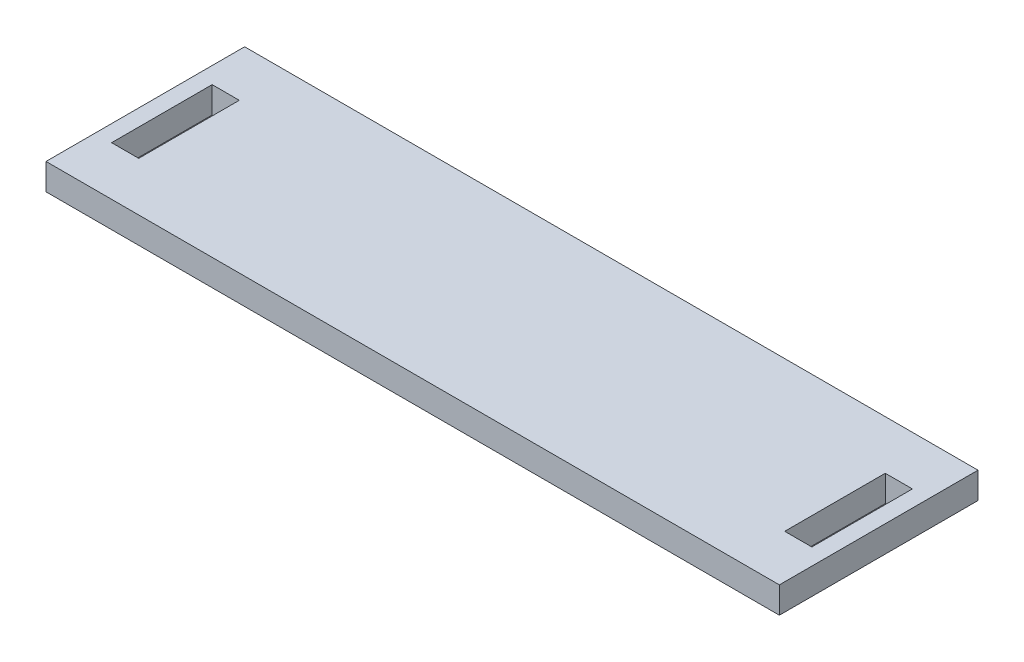
ISO-10303-21;
HEADER;
FILE_DESCRIPTION(('STEP AP214'),'2;1');
FILE_NAME('part.step','',(''),(''),'','','');
FILE_SCHEMA(('AUTOMOTIVE_DESIGN { 1 0 10303 214 1 1 1 1 }'));
ENDSEC;
DATA;
#1=APPLICATION_CONTEXT('core data for automotive mechanical design processes');
#2=APPLICATION_PROTOCOL_DEFINITION('international standard','automotive_design',2000,#1);
#3=PRODUCT_CONTEXT('',#1,'mechanical');
#4=PRODUCT('Part','Part','',(#3));
#5=PRODUCT_RELATED_PRODUCT_CATEGORY('part','',(#4));
#6=PRODUCT_DEFINITION_FORMATION('','',#4);
#7=PRODUCT_DEFINITION_CONTEXT('part definition',#1,'design');
#8=PRODUCT_DEFINITION('design','',#6,#7);
#9=PRODUCT_DEFINITION_SHAPE('','',#8);
#10=(LENGTH_UNIT() NAMED_UNIT(*) SI_UNIT(.MILLI.,.METRE.));
#11=(NAMED_UNIT(*) PLANE_ANGLE_UNIT() SI_UNIT($,.RADIAN.));
#12=(NAMED_UNIT(*) SI_UNIT($,.STERADIAN.) SOLID_ANGLE_UNIT());
#13=UNCERTAINTY_MEASURE_WITH_UNIT(LENGTH_MEASURE(1.E-05),#10,'distance_accuracy_value','');
#14=(GEOMETRIC_REPRESENTATION_CONTEXT(3) GLOBAL_UNCERTAINTY_ASSIGNED_CONTEXT((#13)) GLOBAL_UNIT_ASSIGNED_CONTEXT((#10,
#11,#12)) REPRESENTATION_CONTEXT('',''));
#15=CARTESIAN_POINT('',(0.,0.,0.));
#16=DIRECTION('',(0.,0.,1.));
#17=DIRECTION('',(1.,0.,0.));
#18=AXIS2_PLACEMENT_3D('',#15,#16,#17);
#19=CARTESIAN_POINT('',(0.,3.18,0.));
#20=DIRECTION('',(0.,1.,0.));
#21=DIRECTION('',(0.,0.,1.));
#22=AXIS2_PLACEMENT_3D('',#19,#20,#21);
#23=PLANE('',#22);
#24=DIRECTION('',(0.,0.,1.));
#25=VECTOR('',#24,1.);
#26=CARTESIAN_POINT('',(-55.788376753507,3.18,-0.461132264529056));
#27=LINE('',#26,#25);
#28=CARTESIAN_POINT('',(-55.788376753507,3.18,-0.461132264529056));
#29=VERTEX_POINT('',#28);
#30=CARTESIAN_POINT('',(-55.788376753507,3.18,11.6888677354709));
#31=VERTEX_POINT('',#30);
#32=EDGE_CURVE('E169',#29,#31,#27,.T.);
#33=ORIENTED_EDGE('',*,*,#32,.F.);
#34=DIRECTION('',(-1.,0.,0.));
#35=VECTOR('',#34,1.);
#36=CARTESIAN_POINT('',(-55.788376753507,3.18,-0.461132264529056));
#37=LINE('',#36,#35);
#38=CARTESIAN_POINT('',(-52.508376753507,3.18,-0.461132264529055));
#39=VERTEX_POINT('',#38);
#40=EDGE_CURVE('E174',#39,#29,#37,.T.);
#41=ORIENTED_EDGE('',*,*,#40,.F.);
#42=DIRECTION('',(0.,0.,-1.));
#43=VECTOR('',#42,1.);
#44=CARTESIAN_POINT('',(-52.508376753507,3.18,-0.461132264529055));
#45=LINE('',#44,#43);
#46=CARTESIAN_POINT('',(-52.508376753507,3.18,11.6888677354709));
#47=VERTEX_POINT('',#46);
#48=EDGE_CURVE('E188',#47,#39,#45,.T.);
#49=ORIENTED_EDGE('',*,*,#48,.F.);
#50=DIRECTION('',(1.,0.,0.));
#51=VECTOR('',#50,1.);
#52=CARTESIAN_POINT('',(-55.788376753507,3.18,11.6888677354709));
#53=LINE('',#52,#51);
#54=EDGE_CURVE('E185',#31,#47,#53,.T.);
#55=ORIENTED_EDGE('',*,*,#54,.F.);
#56=EDGE_LOOP('',(#33,#41,#49,#55));
#57=FACE_BOUND('',#56,.T.);
#58=DIRECTION('',(-1.,0.,0.));
#59=VECTOR('',#58,1.);
#60=CARTESIAN_POINT('',(-55.788376753507,3.18,-6.38613226452906));
#61=LINE('',#60,#59);
#62=CARTESIAN_POINT('',(30.821623246493,3.18,-6.38613226452906));
#63=VERTEX_POINT('',#62);
#64=CARTESIAN_POINT('',(-57.788376753507,3.18,-6.38613226452906));
#65=VERTEX_POINT('',#64);
#66=EDGE_CURVE('E11',#63,#65,#61,.T.);
#67=ORIENTED_EDGE('',*,*,#66,.T.);
#68=DIRECTION('',(0.,0.,-1.));
#69=VECTOR('',#68,1.);
#70=CARTESIAN_POINT('',(-57.788376753507,3.18,17.6138677354709));
#71=LINE('',#70,#69);
#72=CARTESIAN_POINT('',(-57.788376753507,3.18,17.6138677354709));
#73=VERTEX_POINT('',#72);
#74=EDGE_CURVE('E210',#73,#65,#71,.T.);
#75=ORIENTED_EDGE('',*,*,#74,.F.);
#76=DIRECTION('',(1.,0.,0.));
#77=VECTOR('',#76,1.);
#78=CARTESIAN_POINT('',(-55.788376753507,3.18,17.6138677354709));
#79=LINE('',#78,#77);
#80=CARTESIAN_POINT('',(30.821623246493,3.18,17.6138677354709));
#81=VERTEX_POINT('',#80);
#82=EDGE_CURVE('E42',#73,#81,#79,.T.);
#83=ORIENTED_EDGE('',*,*,#82,.T.);
#84=DIRECTION('',(0.,0.,-1.));
#85=VECTOR('',#84,1.);
#86=CARTESIAN_POINT('',(30.821623246493,3.18,17.6138677354709));
#87=LINE('',#86,#85);
#88=EDGE_CURVE('E160',#81,#63,#87,.T.);
#89=ORIENTED_EDGE('',*,*,#88,.T.);
#90=EDGE_LOOP('',(#67,#75,#83,#89));
#91=FACE_BOUND('',#90,.T.);
#92=DIRECTION('',(1.,0.,0.));
#93=VECTOR('',#92,1.);
#94=CARTESIAN_POINT('',(28.821623246493,3.18,-0.461132264529062));
#95=LINE('',#94,#93);
#96=CARTESIAN_POINT('',(25.541623246493,3.18,-0.461132264529061));
#97=VERTEX_POINT('',#96);
#98=CARTESIAN_POINT('',(28.821623246493,3.18,-0.461132264529062));
#99=VERTEX_POINT('',#98);
#100=EDGE_CURVE('E148',#97,#99,#95,.T.);
#101=ORIENTED_EDGE('',*,*,#100,.T.);
#102=DIRECTION('',(0.,0.,1.));
#103=VECTOR('',#102,1.);
#104=CARTESIAN_POINT('',(28.821623246493,3.18,-0.461132264529062));
#105=LINE('',#104,#103);
#106=CARTESIAN_POINT('',(28.821623246493,3.18,11.6888677354709));
#107=VERTEX_POINT('',#106);
#108=EDGE_CURVE('E50',#99,#107,#105,.T.);
#109=ORIENTED_EDGE('',*,*,#108,.T.);
#110=DIRECTION('',(-1.,0.,0.));
#111=VECTOR('',#110,1.);
#112=CARTESIAN_POINT('',(28.821623246493,3.18,11.6888677354709));
#113=LINE('',#112,#111);
#114=CARTESIAN_POINT('',(25.541623246493,3.18,11.6888677354709));
#115=VERTEX_POINT('',#114);
#116=EDGE_CURVE('E139',#107,#115,#113,.T.);
#117=ORIENTED_EDGE('',*,*,#116,.T.);
#118=DIRECTION('',(0.,0.,-1.));
#119=VECTOR('',#118,1.);
#120=CARTESIAN_POINT('',(25.541623246493,3.18,-0.461132264529061));
#121=LINE('',#120,#119);
#122=EDGE_CURVE('E142',#115,#97,#121,.T.);
#123=ORIENTED_EDGE('',*,*,#122,.T.);
#124=EDGE_LOOP('',(#101,#109,#117,#123));
#125=FACE_BOUND('',#124,.T.);
#126=ADVANCED_FACE('F33',(#57,#91,#125),#23,.T.);
#127=CARTESIAN_POINT('',(0.,0.,0.));
#128=DIRECTION('',(0.,1.,0.));
#129=DIRECTION('',(0.,0.,1.));
#130=AXIS2_PLACEMENT_3D('',#127,#128,#129);
#131=PLANE('',#130);
#132=DIRECTION('',(1.,0.,0.));
#133=VECTOR('',#132,1.);
#134=CARTESIAN_POINT('',(-55.788376753507,0.,17.6138677354709));
#135=LINE('',#134,#133);
#136=CARTESIAN_POINT('',(-57.788376753507,0.,17.6138677354709));
#137=VERTEX_POINT('',#136);
#138=CARTESIAN_POINT('',(30.821623246493,0.,17.6138677354709));
#139=VERTEX_POINT('',#138);
#140=EDGE_CURVE('E213',#137,#139,#135,.T.);
#141=ORIENTED_EDGE('',*,*,#140,.F.);
#142=DIRECTION('',(0.,0.,1.));
#143=VECTOR('',#142,1.);
#144=CARTESIAN_POINT('',(-57.788376753507,0.,-6.38613226452906));
#145=LINE('',#144,#143);
#146=CARTESIAN_POINT('',(-57.788376753507,0.,-6.38613226452906));
#147=VERTEX_POINT('',#146);
#148=EDGE_CURVE('E204',#147,#137,#145,.T.);
#149=ORIENTED_EDGE('',*,*,#148,.F.);
#150=DIRECTION('',(-1.,0.,0.));
#151=VECTOR('',#150,1.);
#152=CARTESIAN_POINT('',(-55.788376753507,0.,-6.38613226452906));
#153=LINE('',#152,#151);
#154=CARTESIAN_POINT('',(30.821623246493,0.,-6.38613226452906));
#155=VERTEX_POINT('',#154);
#156=EDGE_CURVE('E37',#155,#147,#153,.T.);
#157=ORIENTED_EDGE('',*,*,#156,.F.);
#158=DIRECTION('',(0.,0.,1.));
#159=VECTOR('',#158,1.);
#160=CARTESIAN_POINT('',(30.821623246493,0.,-6.38613226452906));
#161=LINE('',#160,#159);
#162=EDGE_CURVE('E166',#155,#139,#161,.T.);
#163=ORIENTED_EDGE('',*,*,#162,.T.);
#164=EDGE_LOOP('',(#141,#149,#157,#163));
#165=FACE_BOUND('',#164,.T.);
#166=DIRECTION('',(-1.,0.,0.));
#167=VECTOR('',#166,1.);
#168=CARTESIAN_POINT('',(-55.788376753507,0.,-0.461132264529056));
#169=LINE('',#168,#167);
#170=CARTESIAN_POINT('',(-52.508376753507,0.,-0.461132264529055));
#171=VERTEX_POINT('',#170);
#172=CARTESIAN_POINT('',(-55.788376753507,0.,-0.461132264529056));
#173=VERTEX_POINT('',#172);
#174=EDGE_CURVE('E180',#171,#173,#169,.T.);
#175=ORIENTED_EDGE('',*,*,#174,.T.);
#176=DIRECTION('',(0.,0.,1.));
#177=VECTOR('',#176,1.);
#178=CARTESIAN_POINT('',(-55.788376753507,0.,-0.461132264529056));
#179=LINE('',#178,#177);
#180=CARTESIAN_POINT('',(-55.788376753507,0.,11.6888677354709));
#181=VERTEX_POINT('',#180);
#182=EDGE_CURVE('E170',#173,#181,#179,.T.);
#183=ORIENTED_EDGE('',*,*,#182,.T.);
#184=DIRECTION('',(1.,0.,0.));
#185=VECTOR('',#184,1.);
#186=CARTESIAN_POINT('',(-55.788376753507,0.,11.6888677354709));
#187=LINE('',#186,#185);
#188=CARTESIAN_POINT('',(-52.508376753507,0.,11.6888677354709));
#189=VERTEX_POINT('',#188);
#190=EDGE_CURVE('E173',#181,#189,#187,.T.);
#191=ORIENTED_EDGE('',*,*,#190,.T.);
#192=DIRECTION('',(0.,0.,-1.));
#193=VECTOR('',#192,1.);
#194=CARTESIAN_POINT('',(-52.508376753507,0.,-0.461132264529055));
#195=LINE('',#194,#193);
#196=EDGE_CURVE('E177',#189,#171,#195,.T.);
#197=ORIENTED_EDGE('',*,*,#196,.T.);
#198=EDGE_LOOP('',(#175,#183,#191,#197));
#199=FACE_BOUND('',#198,.T.);
#200=DIRECTION('',(0.,0.,1.));
#201=VECTOR('',#200,1.);
#202=CARTESIAN_POINT('',(28.821623246493,0.,-0.461132264529062));
#203=LINE('',#202,#201);
#204=CARTESIAN_POINT('',(28.821623246493,0.,-0.461132264529062));
#205=VERTEX_POINT('',#204);
#206=CARTESIAN_POINT('',(28.821623246493,0.,11.6888677354709));
#207=VERTEX_POINT('',#206);
#208=EDGE_CURVE('E131',#205,#207,#203,.T.);
#209=ORIENTED_EDGE('',*,*,#208,.F.);
#210=DIRECTION('',(1.,0.,0.));
#211=VECTOR('',#210,1.);
#212=CARTESIAN_POINT('',(28.821623246493,0.,-0.461132264529062));
#213=LINE('',#212,#211);
#214=CARTESIAN_POINT('',(25.541623246493,0.,-0.461132264529061));
#215=VERTEX_POINT('',#214);
#216=EDGE_CURVE('E123',#215,#205,#213,.T.);
#217=ORIENTED_EDGE('',*,*,#216,.F.);
#218=DIRECTION('',(0.,0.,-1.));
#219=VECTOR('',#218,1.);
#220=CARTESIAN_POINT('',(25.541623246493,0.,-0.461132264529061));
#221=LINE('',#220,#219);
#222=CARTESIAN_POINT('',(25.541623246493,0.,11.6888677354709));
#223=VERTEX_POINT('',#222);
#224=EDGE_CURVE('E130',#223,#215,#221,.T.);
#225=ORIENTED_EDGE('',*,*,#224,.F.);
#226=DIRECTION('',(-1.,0.,0.));
#227=VECTOR('',#226,1.);
#228=CARTESIAN_POINT('',(28.821623246493,0.,11.6888677354709));
#229=LINE('',#228,#227);
#230=EDGE_CURVE('E135',#207,#223,#229,.T.);
#231=ORIENTED_EDGE('',*,*,#230,.F.);
#232=EDGE_LOOP('',(#209,#217,#225,#231));
#233=FACE_BOUND('',#232,.T.);
#234=ADVANCED_FACE('F138',(#165,#199,#233),#131,.F.);
#235=CARTESIAN_POINT('',(-55.788376753507,3.18,17.6138677354709));
#236=DIRECTION('',(0.,0.,-1.));
#237=DIRECTION('',(-1.,0.,0.));
#238=AXIS2_PLACEMENT_3D('',#235,#236,#237);
#239=PLANE('',#238);
#240=ORIENTED_EDGE('',*,*,#140,.T.);
#241=DIRECTION('',(0.,1.,0.));
#242=VECTOR('',#241,1.);
#243=CARTESIAN_POINT('',(30.821623246493,0.,17.6138677354709));
#244=LINE('',#243,#242);
#245=EDGE_CURVE('E163',#139,#81,#244,.T.);
#246=ORIENTED_EDGE('',*,*,#245,.T.);
#247=ORIENTED_EDGE('',*,*,#82,.F.);
#248=DIRECTION('',(0.,1.,0.));
#249=VECTOR('',#248,1.);
#250=CARTESIAN_POINT('',(-57.788376753507,0.,17.6138677354709));
#251=LINE('',#250,#249);
#252=EDGE_CURVE('E207',#137,#73,#251,.T.);
#253=ORIENTED_EDGE('',*,*,#252,.F.);
#254=EDGE_LOOP('',(#240,#246,#247,#253));
#255=FACE_BOUND('',#254,.T.);
#256=ADVANCED_FACE('F35',(#255),#239,.F.);
#257=CARTESIAN_POINT('',(-55.788376753507,3.18,-6.38613226452906));
#258=DIRECTION('',(0.,0.,1.));
#259=DIRECTION('',(1.,0.,0.));
#260=AXIS2_PLACEMENT_3D('',#257,#258,#259);
#261=PLANE('',#260);
#262=ORIENTED_EDGE('',*,*,#156,.T.);
#263=DIRECTION('',(0.,-1.,0.));
#264=VECTOR('',#263,1.);
#265=CARTESIAN_POINT('',(-57.788376753507,3.18,-6.38613226452906));
#266=LINE('',#265,#264);
#267=EDGE_CURVE('E195',#65,#147,#266,.T.);
#268=ORIENTED_EDGE('',*,*,#267,.F.);
#269=ORIENTED_EDGE('',*,*,#66,.F.);
#270=DIRECTION('',(0.,-1.,0.));
#271=VECTOR('',#270,1.);
#272=CARTESIAN_POINT('',(30.821623246493,3.18,-6.38613226452906));
#273=LINE('',#272,#271);
#274=EDGE_CURVE('E154',#63,#155,#273,.T.);
#275=ORIENTED_EDGE('',*,*,#274,.T.);
#276=EDGE_LOOP('',(#262,#268,#269,#275));
#277=FACE_BOUND('',#276,.T.);
#278=ADVANCED_FACE('F220',(#277),#261,.F.);
#279=CARTESIAN_POINT('',(-57.788376753507,0.,0.));
#280=DIRECTION('',(-1.,0.,0.));
#281=DIRECTION('',(0.,0.,1.));
#282=AXIS2_PLACEMENT_3D('',#279,#280,#281);
#283=PLANE('',#282);
#284=ORIENTED_EDGE('',*,*,#267,.T.);
#285=ORIENTED_EDGE('',*,*,#148,.T.);
#286=ORIENTED_EDGE('',*,*,#252,.T.);
#287=ORIENTED_EDGE('',*,*,#74,.T.);
#288=EDGE_LOOP('',(#284,#285,#286,#287));
#289=FACE_BOUND('',#288,.T.);
#290=ADVANCED_FACE('F226',(#289),#283,.T.);
#291=CARTESIAN_POINT('',(-55.788376753507,0.,-0.461132264529056));
#292=DIRECTION('',(-1.,0.,0.));
#293=DIRECTION('',(0.,0.,1.));
#294=AXIS2_PLACEMENT_3D('',#291,#292,#293);
#295=PLANE('',#294);
#296=ORIENTED_EDGE('',*,*,#32,.T.);
#297=DIRECTION('',(0.,1.,0.));
#298=VECTOR('',#297,1.);
#299=CARTESIAN_POINT('',(-55.788376753507,0.,11.6888677354709));
#300=LINE('',#299,#298);
#301=EDGE_CURVE('E183',#181,#31,#300,.T.);
#302=ORIENTED_EDGE('',*,*,#301,.F.);
#303=ORIENTED_EDGE('',*,*,#182,.F.);
#304=DIRECTION('',(0.,1.,0.));
#305=VECTOR('',#304,1.);
#306=CARTESIAN_POINT('',(-55.788376753507,0.,-0.461132264529056));
#307=LINE('',#306,#305);
#308=EDGE_CURVE('E193',#173,#29,#307,.T.);
#309=ORIENTED_EDGE('',*,*,#308,.T.);
#310=EDGE_LOOP('',(#296,#302,#303,#309));
#311=FACE_BOUND('',#310,.T.);
#312=ADVANCED_FACE('F248',(#311),#295,.F.);
#313=CARTESIAN_POINT('',(-55.788376753507,0.,-0.461132264529056));
#314=DIRECTION('',(0.,0.,-1.));
#315=DIRECTION('',(-1.,0.,0.));
#316=AXIS2_PLACEMENT_3D('',#313,#314,#315);
#317=PLANE('',#316);
#318=ORIENTED_EDGE('',*,*,#40,.T.);
#319=ORIENTED_EDGE('',*,*,#308,.F.);
#320=ORIENTED_EDGE('',*,*,#174,.F.);
#321=DIRECTION('',(0.,1.,0.));
#322=VECTOR('',#321,1.);
#323=CARTESIAN_POINT('',(-52.508376753507,0.,-0.461132264529055));
#324=LINE('',#323,#322);
#325=EDGE_CURVE('E196',#171,#39,#324,.T.);
#326=ORIENTED_EDGE('',*,*,#325,.T.);
#327=EDGE_LOOP('',(#318,#319,#320,#326));
#328=FACE_BOUND('',#327,.T.);
#329=ADVANCED_FACE('F251',(#328),#317,.F.);
#330=CARTESIAN_POINT('',(-52.508376753507,0.,-0.461132264529055));
#331=DIRECTION('',(1.,0.,0.));
#332=DIRECTION('',(0.,0.,-1.));
#333=AXIS2_PLACEMENT_3D('',#330,#331,#332);
#334=PLANE('',#333);
#335=ORIENTED_EDGE('',*,*,#48,.T.);
#336=ORIENTED_EDGE('',*,*,#325,.F.);
#337=ORIENTED_EDGE('',*,*,#196,.F.);
#338=DIRECTION('',(0.,1.,0.));
#339=VECTOR('',#338,1.);
#340=CARTESIAN_POINT('',(-52.508376753507,0.,11.6888677354709));
#341=LINE('',#340,#339);
#342=EDGE_CURVE('E198',#189,#47,#341,.T.);
#343=ORIENTED_EDGE('',*,*,#342,.T.);
#344=EDGE_LOOP('',(#335,#336,#337,#343));
#345=FACE_BOUND('',#344,.T.);
#346=ADVANCED_FACE('F256',(#345),#334,.F.);
#347=CARTESIAN_POINT('',(-55.788376753507,0.,11.6888677354709));
#348=DIRECTION('',(0.,0.,1.));
#349=DIRECTION('',(1.,0.,0.));
#350=AXIS2_PLACEMENT_3D('',#347,#348,#349);
#351=PLANE('',#350);
#352=ORIENTED_EDGE('',*,*,#54,.T.);
#353=ORIENTED_EDGE('',*,*,#342,.F.);
#354=ORIENTED_EDGE('',*,*,#190,.F.);
#355=ORIENTED_EDGE('',*,*,#301,.T.);
#356=EDGE_LOOP('',(#352,#353,#354,#355));
#357=FACE_BOUND('',#356,.T.);
#358=ADVANCED_FACE('F253',(#357),#351,.F.);
#359=CARTESIAN_POINT('',(30.821623246493,0.,0.));
#360=DIRECTION('',(1.,0.,0.));
#361=DIRECTION('',(0.,0.,1.));
#362=AXIS2_PLACEMENT_3D('',#359,#360,#361);
#363=PLANE('',#362);
#364=ORIENTED_EDGE('',*,*,#274,.F.);
#365=ORIENTED_EDGE('',*,*,#88,.F.);
#366=ORIENTED_EDGE('',*,*,#245,.F.);
#367=ORIENTED_EDGE('',*,*,#162,.F.);
#368=EDGE_LOOP('',(#364,#365,#366,#367));
#369=FACE_BOUND('',#368,.T.);
#370=ADVANCED_FACE('F232',(#369),#363,.T.);
#371=CARTESIAN_POINT('',(28.821623246493,0.,-0.461132264529062));
#372=DIRECTION('',(-1.,0.,0.));
#373=DIRECTION('',(0.,0.,1.));
#374=AXIS2_PLACEMENT_3D('',#371,#372,#373);
#375=PLANE('',#374);
#376=ORIENTED_EDGE('',*,*,#108,.F.);
#377=DIRECTION('',(0.,1.,0.));
#378=VECTOR('',#377,1.);
#379=CARTESIAN_POINT('',(28.821623246493,0.,-0.461132264529062));
#380=LINE('',#379,#378);
#381=EDGE_CURVE('E125',#205,#99,#380,.T.);
#382=ORIENTED_EDGE('',*,*,#381,.F.);
#383=ORIENTED_EDGE('',*,*,#208,.T.);
#384=DIRECTION('',(0.,1.,0.));
#385=VECTOR('',#384,1.);
#386=CARTESIAN_POINT('',(28.821623246493,0.,11.6888677354709));
#387=LINE('',#386,#385);
#388=EDGE_CURVE('E152',#207,#107,#387,.T.);
#389=ORIENTED_EDGE('',*,*,#388,.T.);
#390=EDGE_LOOP('',(#376,#382,#383,#389));
#391=FACE_BOUND('',#390,.T.);
#392=ADVANCED_FACE('F133',(#391),#375,.T.);
#393=CARTESIAN_POINT('',(28.821623246493,0.,11.6888677354709));
#394=DIRECTION('',(0.,0.,-1.));
#395=DIRECTION('',(-1.,0.,0.));
#396=AXIS2_PLACEMENT_3D('',#393,#394,#395);
#397=PLANE('',#396);
#398=ORIENTED_EDGE('',*,*,#116,.F.);
#399=ORIENTED_EDGE('',*,*,#388,.F.);
#400=ORIENTED_EDGE('',*,*,#230,.T.);
#401=DIRECTION('',(0.,1.,0.));
#402=VECTOR('',#401,1.);
#403=CARTESIAN_POINT('',(25.541623246493,0.,11.6888677354709));
#404=LINE('',#403,#402);
#405=EDGE_CURVE('E155',#223,#115,#404,.T.);
#406=ORIENTED_EDGE('',*,*,#405,.T.);
#407=EDGE_LOOP('',(#398,#399,#400,#406));
#408=FACE_BOUND('',#407,.T.);
#409=ADVANCED_FACE('F268',(#408),#397,.T.);
#410=CARTESIAN_POINT('',(25.541623246493,0.,-0.461132264529061));
#411=DIRECTION('',(1.,0.,0.));
#412=DIRECTION('',(0.,0.,-1.));
#413=AXIS2_PLACEMENT_3D('',#410,#411,#412);
#414=PLANE('',#413);
#415=ORIENTED_EDGE('',*,*,#122,.F.);
#416=ORIENTED_EDGE('',*,*,#405,.F.);
#417=ORIENTED_EDGE('',*,*,#224,.T.);
#418=DIRECTION('',(0.,1.,0.));
#419=VECTOR('',#418,1.);
#420=CARTESIAN_POINT('',(25.541623246493,0.,-0.461132264529061));
#421=LINE('',#420,#419);
#422=EDGE_CURVE('E58',#215,#97,#421,.T.);
#423=ORIENTED_EDGE('',*,*,#422,.T.);
#424=EDGE_LOOP('',(#415,#416,#417,#423));
#425=FACE_BOUND('',#424,.T.);
#426=ADVANCED_FACE('F271',(#425),#414,.T.);
#427=CARTESIAN_POINT('',(28.821623246493,0.,-0.461132264529062));
#428=DIRECTION('',(0.,0.,1.));
#429=DIRECTION('',(1.,0.,0.));
#430=AXIS2_PLACEMENT_3D('',#427,#428,#429);
#431=PLANE('',#430);
#432=ORIENTED_EDGE('',*,*,#100,.F.);
#433=ORIENTED_EDGE('',*,*,#422,.F.);
#434=ORIENTED_EDGE('',*,*,#216,.T.);
#435=ORIENTED_EDGE('',*,*,#381,.T.);
#436=EDGE_LOOP('',(#432,#433,#434,#435));
#437=FACE_BOUND('',#436,.T.);
#438=ADVANCED_FACE('F124',(#437),#431,.T.);
#439=CLOSED_SHELL('',(#126,#234,#256,#278,#290,#312,#329,#346,#358,#370,#392,#409,#426,#438));
#440=MANIFOLD_SOLID_BREP('B2',#439);
#441=ADVANCED_BREP_SHAPE_REPRESENTATION('',(#18,#440),#14);
#442=SHAPE_DEFINITION_REPRESENTATION(#9,#441);
ENDSEC;
END-ISO-10303-21;
